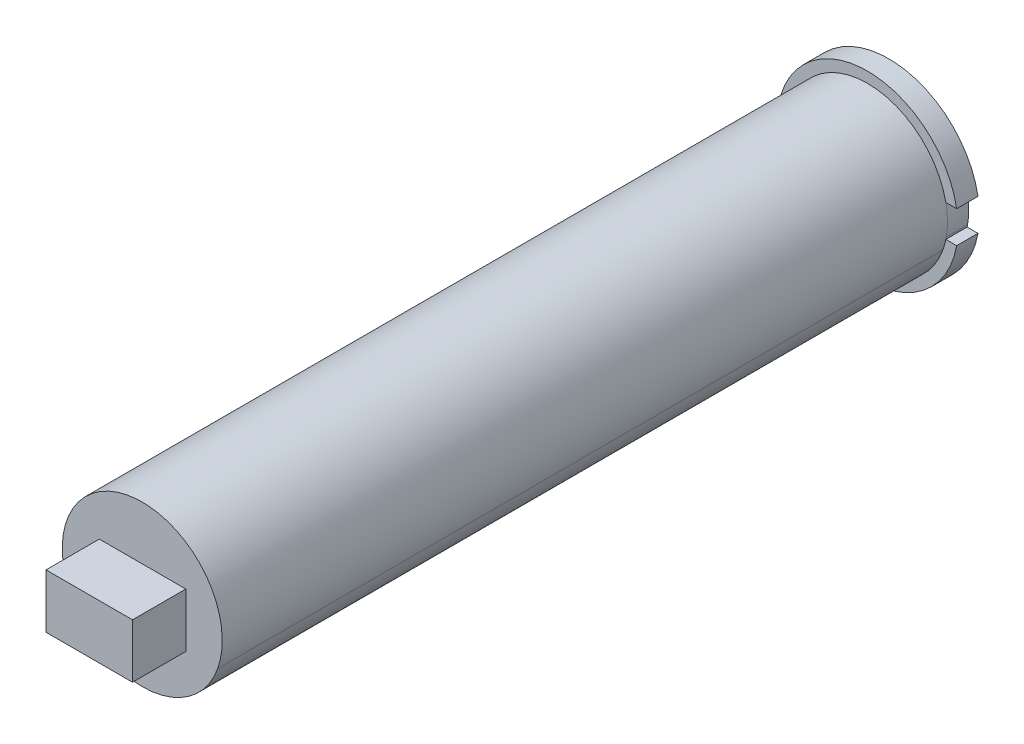
ISO-10303-21;
HEADER;
FILE_DESCRIPTION(('STEP AP214'),'2;1');
FILE_NAME('part.step','',(''),(''),'','','');
FILE_SCHEMA(('AUTOMOTIVE_DESIGN { 1 0 10303 214 1 1 1 1 }'));
ENDSEC;
DATA;
#1=APPLICATION_CONTEXT('core data for automotive mechanical design processes');
#2=APPLICATION_PROTOCOL_DEFINITION('international standard','automotive_design',2000,#1);
#3=PRODUCT_CONTEXT('',#1,'mechanical');
#4=PRODUCT('Part','Part','',(#3));
#5=PRODUCT_RELATED_PRODUCT_CATEGORY('part','',(#4));
#6=PRODUCT_DEFINITION_FORMATION('','',#4);
#7=PRODUCT_DEFINITION_CONTEXT('part definition',#1,'design');
#8=PRODUCT_DEFINITION('design','',#6,#7);
#9=PRODUCT_DEFINITION_SHAPE('','',#8);
#10=(LENGTH_UNIT() NAMED_UNIT(*) SI_UNIT(.MILLI.,.METRE.));
#11=(NAMED_UNIT(*) PLANE_ANGLE_UNIT() SI_UNIT($,.RADIAN.));
#12=(NAMED_UNIT(*) SI_UNIT($,.STERADIAN.) SOLID_ANGLE_UNIT());
#13=UNCERTAINTY_MEASURE_WITH_UNIT(LENGTH_MEASURE(1.E-05),#10,'distance_accuracy_value','');
#14=(GEOMETRIC_REPRESENTATION_CONTEXT(3) GLOBAL_UNCERTAINTY_ASSIGNED_CONTEXT((#13)) GLOBAL_UNIT_ASSIGNED_CONTEXT((#10,
#11,#12)) REPRESENTATION_CONTEXT('',''));
#15=CARTESIAN_POINT('',(0.,0.,0.));
#16=DIRECTION('',(0.,0.,1.));
#17=DIRECTION('',(1.,0.,0.));
#18=AXIS2_PLACEMENT_3D('',#15,#16,#17);
#19=CARTESIAN_POINT('',(0.,-2.19276085067222E-05,70.));
#20=DIRECTION('',(0.,0.,-1.));
#21=DIRECTION('',(-1.,0.,0.));
#22=AXIS2_PLACEMENT_3D('',#19,#20,#21);
#23=PLANE('',#22);
#24=CARTESIAN_POINT('',(0.,2.363829224028E-05,70.));
#25=DIRECTION('',(0.,0.,1.));
#26=DIRECTION('',(1.,0.,0.));
#27=AXIS2_PLACEMENT_3D('',#24,#25,#26);
#28=CIRCLE('',#27,7.49997237005401);
#29=CARTESIAN_POINT('',(7.07103819729768,-2.50000258335265,70.));
#30=VERTEX_POINT('',#29);
#31=CARTESIAN_POINT('',(-7.07103819729768,-2.50000258335265,70.));
#32=VERTEX_POINT('',#31);
#33=EDGE_CURVE('E204',#30,#32,#28,.T.);
#34=ORIENTED_EDGE('',*,*,#33,.T.);
#35=CARTESIAN_POINT('',(0.,-2.19276085067222E-05,70.));
#36=DIRECTION('',(0.,0.,1.));
#37=DIRECTION('',(1.,0.,0.));
#38=AXIS2_PLACEMENT_3D('',#35,#36,#37);
#39=CIRCLE('',#38,7.49997408073774);
#40=EDGE_CURVE('E12',#32,#30,#39,.T.);
#41=ORIENTED_EDGE('',*,*,#40,.T.);
#42=EDGE_LOOP('',(#34,#41));
#43=FACE_BOUND('',#42,.T.);
#44=DIRECTION('',(0.,-1.,0.));
#45=VECTOR('',#44,1.);
#46=CARTESIAN_POINT('',(-4.02605170519821,2.47573817180809,70.));
#47=LINE('',#46,#45);
#48=CARTESIAN_POINT('',(-4.02605170519821,2.47573817180809,70.));
#49=VERTEX_POINT('',#48);
#50=CARTESIAN_POINT('',(-4.02605170519821,-2.59368477236334,70.));
#51=VERTEX_POINT('',#50);
#52=EDGE_CURVE('E57',#49,#51,#47,.T.);
#53=ORIENTED_EDGE('',*,*,#52,.F.);
#54=DIRECTION('',(-1.,0.,0.));
#55=VECTOR('',#54,1.);
#56=CARTESIAN_POINT('',(-4.02605170519821,2.47573817180809,70.));
#57=LINE('',#56,#55);
#58=CARTESIAN_POINT('',(4.08502500547608,2.47573817180809,70.));
#59=VERTEX_POINT('',#58);
#60=EDGE_CURVE('E61',#59,#49,#57,.T.);
#61=ORIENTED_EDGE('',*,*,#60,.F.);
#62=DIRECTION('',(0.,1.,0.));
#63=VECTOR('',#62,1.);
#64=CARTESIAN_POINT('',(4.08502500547608,2.47573817180809,70.));
#65=LINE('',#64,#63);
#66=CARTESIAN_POINT('',(4.08502500547608,-2.59368477236334,70.));
#67=VERTEX_POINT('',#66);
#68=EDGE_CURVE('E569',#67,#59,#65,.T.);
#69=ORIENTED_EDGE('',*,*,#68,.F.);
#70=DIRECTION('',(1.,0.,0.));
#71=VECTOR('',#70,1.);
#72=CARTESIAN_POINT('',(-4.02605170519821,-2.59368477236334,70.));
#73=LINE('',#72,#71);
#74=EDGE_CURVE('E575',#51,#67,#73,.T.);
#75=ORIENTED_EDGE('',*,*,#74,.F.);
#76=EDGE_LOOP('',(#53,#61,#69,#75));
#77=FACE_BOUND('',#76,.T.);
#78=ADVANCED_FACE('F40',(#43,#77),#23,.F.);
#79=CARTESIAN_POINT('',(0.,0.,2.));
#80=DIRECTION('',(0.,0.,1.));
#81=DIRECTION('',(1.,0.,0.));
#82=AXIS2_PLACEMENT_3D('',#79,#80,#81);
#83=PLANE('',#82);
#84=DIRECTION('',(1.,0.,0.));
#85=VECTOR('',#84,1.);
#86=CARTESIAN_POINT('',(-8.36657714843747,1.4999960083463,2.));
#87=LINE('',#86,#85);
#88=CARTESIAN_POINT('',(-8.36657714843747,1.4999960083463,2.));
#89=VERTEX_POINT('',#88);
#90=CARTESIAN_POINT('',(-7.34844666855847,1.4999960083463,2.));
#91=VERTEX_POINT('',#90);
#92=EDGE_CURVE('E416',#89,#91,#87,.T.);
#93=ORIENTED_EDGE('',*,*,#92,.T.);
#94=CARTESIAN_POINT('',(0.,2.363829224028E-05,2.));
#95=DIRECTION('',(0.,0.,1.));
#96=DIRECTION('',(1.,0.,0.));
#97=AXIS2_PLACEMENT_3D('',#94,#95,#96);
#98=CIRCLE('',#97,7.49997237005401);
#99=CARTESIAN_POINT('',(7.34844679009372,1.49999541293832,2.));
#100=VERTEX_POINT('',#99);
#101=EDGE_CURVE('E210',#100,#91,#98,.T.);
#102=ORIENTED_EDGE('',*,*,#101,.F.);
#103=DIRECTION('',(1.,0.,0.));
#104=VECTOR('',#103,1.);
#105=CARTESIAN_POINT('',(8.36657714843747,1.4999960083463,2.));
#106=LINE('',#105,#104);
#107=CARTESIAN_POINT('',(8.36657714843747,1.4999960083463,2.));
#108=VERTEX_POINT('',#107);
#109=EDGE_CURVE('E399',#100,#108,#106,.T.);
#110=ORIENTED_EDGE('',*,*,#109,.T.);
#111=CARTESIAN_POINT('',(0.,2.363829224028E-05,2.));
#112=DIRECTION('',(0.,0.,1.));
#113=DIRECTION('',(1.,0.,0.));
#114=AXIS2_PLACEMENT_3D('',#111,#112,#113);
#115=CIRCLE('',#114,8.49997237005402);
#116=EDGE_CURVE('E402',#108,#89,#115,.T.);
#117=ORIENTED_EDGE('',*,*,#116,.T.);
#118=EDGE_LOOP('',(#93,#102,#110,#117));
#119=FACE_BOUND('',#118,.T.);
#120=ADVANCED_FACE('F363',(#119),#83,.T.);
#121=CARTESIAN_POINT('',(0.,2.363829224028E-05,2.));
#122=DIRECTION('',(0.,0.,1.));
#123=DIRECTION('',(1.,0.,0.));
#124=AXIS2_PLACEMENT_3D('',#121,#122,#123);
#125=CIRCLE('',#124,7.49997237005402);
#126=CARTESIAN_POINT('',(-7.07103841952553,-2.5000019548068,2.));
#127=VERTEX_POINT('',#126);
#128=EDGE_CURVE('E186',#91,#127,#125,.T.);
#129=ORIENTED_EDGE('',*,*,#128,.F.);
#130=CARTESIAN_POINT('',(-0.000946561122261436,-3.99165370201793E-06,2.));
#131=DIRECTION('',(0.,0.,1.));
#132=DIRECTION('',(1.,0.,0.));
#133=AXIS2_PLACEMENT_3D('',#130,#131,#132);
#134=CIRCLE('',#133,7.49905343887769);
#135=CARTESIAN_POINT('',(-7.3484497070313,-1.5000039916537,2.));
#136=VERTEX_POINT('',#135);
#137=EDGE_CURVE('E418',#91,#136,#134,.T.);
#138=ORIENTED_EDGE('',*,*,#137,.T.);
#139=DIRECTION('',(-1.,0.,0.));
#140=VECTOR('',#139,1.);
#141=CARTESIAN_POINT('',(-7.3484497070313,-1.5000039916537,2.));
#142=LINE('',#141,#140);
#143=CARTESIAN_POINT('',(-8.36657714843747,-1.5000039916537,2.));
#144=VERTEX_POINT('',#143);
#145=EDGE_CURVE('E49',#136,#144,#142,.T.);
#146=ORIENTED_EDGE('',*,*,#145,.T.);
#147=CARTESIAN_POINT('',(0.,-2.19276085067222E-05,2.));
#148=DIRECTION('',(0.,0.,1.));
#149=DIRECTION('',(1.,0.,0.));
#150=AXIS2_PLACEMENT_3D('',#147,#148,#149);
#151=CIRCLE('',#150,8.49997408073774);
#152=CARTESIAN_POINT('',(8.36657714843747,-1.5000039916537,2.));
#153=VERTEX_POINT('',#152);
#154=EDGE_CURVE('E264',#144,#153,#151,.T.);
#155=ORIENTED_EDGE('',*,*,#154,.T.);
#156=DIRECTION('',(-1.,0.,0.));
#157=VECTOR('',#156,1.);
#158=CARTESIAN_POINT('',(7.34844970703119,-1.5000039916537,2.));
#159=LINE('',#158,#157);
#160=CARTESIAN_POINT('',(7.34844970703119,-1.5000039916537,2.));
#161=VERTEX_POINT('',#160);
#162=EDGE_CURVE('E261',#153,#161,#159,.T.);
#163=ORIENTED_EDGE('',*,*,#162,.T.);
#164=DIRECTION('',(0.186875116396291,0.98238367803617,0.));
#165=VECTOR('',#164,1.);
#166=CARTESIAN_POINT('',(7.38604736328119,-1.30235689692715,2.));
#167=LINE('',#166,#165);
#168=CARTESIAN_POINT('',(7.34864666142599,-1.49896862222355,2.));
#169=VERTEX_POINT('',#168);
#170=EDGE_CURVE('E254',#161,#169,#167,.T.);
#171=ORIENTED_EDGE('',*,*,#170,.T.);
#172=CARTESIAN_POINT('',(7.07103841952553,-2.50000195480681,2.));
#173=VERTEX_POINT('',#172);
#174=EDGE_CURVE('E178',#173,#169,#125,.T.);
#175=ORIENTED_EDGE('',*,*,#174,.F.);
#176=CARTESIAN_POINT('',(0.,-2.19276085067222E-05,2.));
#177=DIRECTION('',(0.,0.,1.));
#178=DIRECTION('',(1.,0.,0.));
#179=AXIS2_PLACEMENT_3D('',#176,#177,#178);
#180=CIRCLE('',#179,7.49997408073774);
#181=EDGE_CURVE('E207',#127,#173,#180,.T.);
#182=ORIENTED_EDGE('',*,*,#181,.F.);
#183=EDGE_LOOP('',(#129,#138,#146,#155,#163,#171,#175,#182));
#184=FACE_BOUND('',#183,.T.);
#185=ADVANCED_FACE('F359',(#184),#83,.T.);
#186=CARTESIAN_POINT('',(0.,-2.19276085067222E-05,70.));
#187=DIRECTION('',(0.,0.,-1.));
#188=DIRECTION('',(-1.,0.,0.));
#189=AXIS2_PLACEMENT_3D('',#186,#187,#188);
#190=CYLINDRICAL_SURFACE('',#189,8.49997408073774);
#191=ORIENTED_EDGE('',*,*,#154,.F.);
#192=DIRECTION('',(0.,0.,-1.));
#193=VECTOR('',#192,1.);
#194=CARTESIAN_POINT('',(-8.36657714843747,-1.5000039916537,70.));
#195=LINE('',#194,#193);
#196=CARTESIAN_POINT('',(-8.36657714843747,-1.5000039916537,0.));
#197=VERTEX_POINT('',#196);
#198=EDGE_CURVE('E293',#144,#197,#195,.T.);
#199=ORIENTED_EDGE('',*,*,#198,.T.);
#200=CARTESIAN_POINT('',(0.,-2.19276085067222E-05,0.));
#201=DIRECTION('',(0.,0.,1.));
#202=DIRECTION('',(-1.,0.,0.));
#203=AXIS2_PLACEMENT_3D('',#200,#201,#202);
#204=CIRCLE('',#203,8.49997408073774);
#205=CARTESIAN_POINT('',(8.36657714843747,-1.5000039916537,0.));
#206=VERTEX_POINT('',#205);
#207=EDGE_CURVE('E266',#197,#206,#204,.T.);
#208=ORIENTED_EDGE('',*,*,#207,.T.);
#209=DIRECTION('',(0.,0.,-1.));
#210=VECTOR('',#209,1.);
#211=CARTESIAN_POINT('',(8.36657714843747,-1.5000039916537,70.));
#212=LINE('',#211,#210);
#213=EDGE_CURVE('E309',#153,#206,#212,.T.);
#214=ORIENTED_EDGE('',*,*,#213,.F.);
#215=EDGE_LOOP('',(#191,#199,#208,#214));
#216=FACE_BOUND('',#215,.T.);
#217=ADVANCED_FACE('F42',(#216),#190,.T.);
#218=CARTESIAN_POINT('',(7.34844970703119,-1.5000039916537,70.));
#219=DIRECTION('',(0.,-1.,0.));
#220=DIRECTION('',(0.,0.,-1.));
#221=AXIS2_PLACEMENT_3D('',#218,#219,#220);
#222=PLANE('',#221);
#223=ORIENTED_EDGE('',*,*,#162,.F.);
#224=ORIENTED_EDGE('',*,*,#213,.T.);
#225=DIRECTION('',(-1.,0.,0.));
#226=VECTOR('',#225,1.);
#227=CARTESIAN_POINT('',(7.34844970703119,-1.5000039916537,0.));
#228=LINE('',#227,#226);
#229=CARTESIAN_POINT('',(7.34844970703119,-1.5000039916537,0.));
#230=VERTEX_POINT('',#229);
#231=EDGE_CURVE('E269',#206,#230,#228,.T.);
#232=ORIENTED_EDGE('',*,*,#231,.T.);
#233=DIRECTION('',(0.,0.,-1.));
#234=VECTOR('',#233,1.);
#235=CARTESIAN_POINT('',(7.34844970703119,-1.5000039916537,70.));
#236=LINE('',#235,#234);
#237=EDGE_CURVE('E307',#161,#230,#236,.T.);
#238=ORIENTED_EDGE('',*,*,#237,.F.);
#239=EDGE_LOOP('',(#223,#224,#232,#238));
#240=FACE_BOUND('',#239,.T.);
#241=ADVANCED_FACE('F351',(#240),#222,.F.);
#242=CARTESIAN_POINT('',(7.38604736328119,-1.30235689692715,70.));
#243=DIRECTION('',(-0.98238367803617,0.186875116396291,0.));
#244=DIRECTION('',(-0.186875116396291,-0.98238367803617,0.));
#245=AXIS2_PLACEMENT_3D('',#242,#243,#244);
#246=PLANE('',#245);
#247=ORIENTED_EDGE('',*,*,#170,.F.);
#248=ORIENTED_EDGE('',*,*,#237,.T.);
#249=DIRECTION('',(0.186875116396291,0.98238367803617,0.));
#250=VECTOR('',#249,1.);
#251=CARTESIAN_POINT('',(7.38604736328119,-1.30235689692715,0.));
#252=LINE('',#251,#250);
#253=CARTESIAN_POINT('',(7.38604736328119,-1.30235689692715,0.));
#254=VERTEX_POINT('',#253);
#255=EDGE_CURVE('E272',#230,#254,#252,.T.);
#256=ORIENTED_EDGE('',*,*,#255,.T.);
#257=DIRECTION('',(0.,0.,-1.));
#258=VECTOR('',#257,1.);
#259=CARTESIAN_POINT('',(7.38604736328119,-1.30235689692715,70.));
#260=LINE('',#259,#258);
#261=CARTESIAN_POINT('',(7.38604736328119,-1.30235689692715,2.));
#262=VERTEX_POINT('',#261);
#263=EDGE_CURVE('E305',#262,#254,#260,.T.);
#264=ORIENTED_EDGE('',*,*,#263,.F.);
#265=CARTESIAN_POINT('',(7.38576242539026,-1.30385478674093,2.));
#266=VERTEX_POINT('',#265);
#267=EDGE_CURVE('E251',#266,#262,#167,.T.);
#268=ORIENTED_EDGE('',*,*,#267,.F.);
#269=CARTESIAN_POINT('',(0.,2.363829224028E-05,2.));
#270=DIRECTION('',(0.,0.,1.));
#271=DIRECTION('',(0.97982316451828,-0.199866371041711,0.));
#272=AXIS2_PLACEMENT_3D('',#269,#270,#271);
#273=CIRCLE('',#272,7.49997237005401);
#274=EDGE_CURVE('E201',#169,#266,#273,.T.);
#275=ORIENTED_EDGE('',*,*,#274,.F.);
#276=EDGE_LOOP('',(#247,#248,#256,#264,#268,#275));
#277=FACE_BOUND('',#276,.T.);
#278=ADVANCED_FACE('F341',(#277),#246,.F.);
#279=CARTESIAN_POINT('',(0.000876369651070519,-1.10833462685367E-05,70.));
#280=DIRECTION('',(0.,0.,-1.));
#281=DIRECTION('',(-1.,0.,0.));
#282=AXIS2_PLACEMENT_3D('',#279,#280,#281);
#283=CYLINDRICAL_SURFACE('',#282,7.49912363035223);
#284=CARTESIAN_POINT('',(0.000876369651070519,-1.10833462685367E-05,2.));
#285=DIRECTION('',(0.,0.,1.));
#286=DIRECTION('',(1.,0.,0.));
#287=AXIS2_PLACEMENT_3D('',#284,#285,#286);
#288=CIRCLE('',#287,7.49912363035223);
#289=EDGE_CURVE('E255',#262,#100,#288,.T.);
#290=ORIENTED_EDGE('',*,*,#289,.F.);
#291=ORIENTED_EDGE('',*,*,#263,.T.);
#292=CARTESIAN_POINT('',(0.000876369651070519,-1.10833462685367E-05,0.));
#293=DIRECTION('',(0.,0.,1.));
#294=DIRECTION('',(-1.,0.,0.));
#295=AXIS2_PLACEMENT_3D('',#292,#293,#294);
#296=CIRCLE('',#295,7.49912363035223);
#297=CARTESIAN_POINT('',(7.34844970703119,1.4999960083463,0.));
#298=VERTEX_POINT('',#297);
#299=EDGE_CURVE('E275',#254,#298,#296,.T.);
#300=ORIENTED_EDGE('',*,*,#299,.T.);
#301=DIRECTION('',(0.,0.,-1.));
#302=VECTOR('',#301,1.);
#303=CARTESIAN_POINT('',(7.34844970703119,1.4999960083463,70.));
#304=LINE('',#303,#302);
#305=EDGE_CURVE('E303',#100,#298,#304,.T.);
#306=ORIENTED_EDGE('',*,*,#305,.F.);
#307=EDGE_LOOP('',(#290,#291,#300,#306));
#308=FACE_BOUND('',#307,.T.);
#309=ADVANCED_FACE('F350',(#308),#283,.T.);
#310=CARTESIAN_POINT('',(8.36657714843747,1.4999960083463,70.));
#311=DIRECTION('',(0.,1.,0.));
#312=DIRECTION('',(0.,0.,1.));
#313=AXIS2_PLACEMENT_3D('',#310,#311,#312);
#314=PLANE('',#313);
#315=ORIENTED_EDGE('',*,*,#109,.F.);
#316=ORIENTED_EDGE('',*,*,#305,.T.);
#317=DIRECTION('',(1.,0.,0.));
#318=VECTOR('',#317,1.);
#319=CARTESIAN_POINT('',(8.36657714843747,1.4999960083463,0.));
#320=LINE('',#319,#318);
#321=CARTESIAN_POINT('',(8.36657714843747,1.4999960083463,0.));
#322=VERTEX_POINT('',#321);
#323=EDGE_CURVE('E278',#298,#322,#320,.T.);
#324=ORIENTED_EDGE('',*,*,#323,.T.);
#325=DIRECTION('',(0.,0.,-1.));
#326=VECTOR('',#325,1.);
#327=CARTESIAN_POINT('',(8.36657714843747,1.4999960083463,70.));
#328=LINE('',#327,#326);
#329=EDGE_CURVE('E301',#108,#322,#328,.T.);
#330=ORIENTED_EDGE('',*,*,#329,.F.);
#331=EDGE_LOOP('',(#315,#316,#324,#330));
#332=FACE_BOUND('',#331,.T.);
#333=ADVANCED_FACE('F389',(#332),#314,.F.);
#334=CARTESIAN_POINT('',(0.,2.363829224028E-05,70.));
#335=DIRECTION('',(0.,0.,-1.));
#336=DIRECTION('',(-1.,0.,0.));
#337=AXIS2_PLACEMENT_3D('',#334,#335,#336);
#338=CYLINDRICAL_SURFACE('',#337,8.49997237005402);
#339=ORIENTED_EDGE('',*,*,#116,.F.);
#340=ORIENTED_EDGE('',*,*,#329,.T.);
#341=CARTESIAN_POINT('',(0.,2.363829224028E-05,0.));
#342=DIRECTION('',(0.,0.,1.));
#343=DIRECTION('',(1.,0.,0.));
#344=AXIS2_PLACEMENT_3D('',#341,#342,#343);
#345=CIRCLE('',#344,8.49997237005402);
#346=CARTESIAN_POINT('',(-8.36657714843747,1.4999960083463,0.));
#347=VERTEX_POINT('',#346);
#348=EDGE_CURVE('E281',#322,#347,#345,.T.);
#349=ORIENTED_EDGE('',*,*,#348,.T.);
#350=DIRECTION('',(0.,0.,-1.));
#351=VECTOR('',#350,1.);
#352=CARTESIAN_POINT('',(-8.36657714843747,1.4999960083463,70.));
#353=LINE('',#352,#351);
#354=EDGE_CURVE('E299',#89,#347,#353,.T.);
#355=ORIENTED_EDGE('',*,*,#354,.F.);
#356=EDGE_LOOP('',(#339,#340,#349,#355));
#357=FACE_BOUND('',#356,.T.);
#358=ADVANCED_FACE('F387',(#357),#338,.T.);
#359=CARTESIAN_POINT('',(-8.36657714843747,1.4999960083463,70.));
#360=DIRECTION('',(0.,1.,0.));
#361=DIRECTION('',(0.,0.,1.));
#362=AXIS2_PLACEMENT_3D('',#359,#360,#361);
#363=PLANE('',#362);
#364=ORIENTED_EDGE('',*,*,#92,.F.);
#365=ORIENTED_EDGE('',*,*,#354,.T.);
#366=DIRECTION('',(1.,0.,0.));
#367=VECTOR('',#366,1.);
#368=CARTESIAN_POINT('',(-8.36657714843747,1.4999960083463,0.));
#369=LINE('',#368,#367);
#370=CARTESIAN_POINT('',(-7.3484497070313,1.4999960083463,0.));
#371=VERTEX_POINT('',#370);
#372=EDGE_CURVE('E284',#347,#371,#369,.T.);
#373=ORIENTED_EDGE('',*,*,#372,.T.);
#374=DIRECTION('',(0.,0.,-1.));
#375=VECTOR('',#374,1.);
#376=CARTESIAN_POINT('',(-7.3484497070313,1.4999960083463,70.));
#377=LINE('',#376,#375);
#378=EDGE_CURVE('E297',#91,#371,#377,.T.);
#379=ORIENTED_EDGE('',*,*,#378,.F.);
#380=EDGE_LOOP('',(#364,#365,#373,#379));
#381=FACE_BOUND('',#380,.T.);
#382=ADVANCED_FACE('F383',(#381),#363,.F.);
#383=CARTESIAN_POINT('',(-0.000946561122261436,-3.99165370201793E-06,70.));
#384=DIRECTION('',(0.,0.,-1.));
#385=DIRECTION('',(-1.,0.,0.));
#386=AXIS2_PLACEMENT_3D('',#383,#384,#385);
#387=CYLINDRICAL_SURFACE('',#386,7.49905343887769);
#388=ORIENTED_EDGE('',*,*,#137,.F.);
#389=ORIENTED_EDGE('',*,*,#378,.T.);
#390=CARTESIAN_POINT('',(-0.000946561122261436,-3.99165370201793E-06,0.));
#391=DIRECTION('',(0.,0.,1.));
#392=DIRECTION('',(1.,0.,0.));
#393=AXIS2_PLACEMENT_3D('',#390,#391,#392);
#394=CIRCLE('',#393,7.49905343887769);
#395=CARTESIAN_POINT('',(-7.3484497070313,-1.5000039916537,0.));
#396=VERTEX_POINT('',#395);
#397=EDGE_CURVE('E287',#371,#396,#394,.T.);
#398=ORIENTED_EDGE('',*,*,#397,.T.);
#399=DIRECTION('',(0.,0.,-1.));
#400=VECTOR('',#399,1.);
#401=CARTESIAN_POINT('',(-7.3484497070313,-1.5000039916537,70.));
#402=LINE('',#401,#400);
#403=EDGE_CURVE('E295',#136,#396,#402,.T.);
#404=ORIENTED_EDGE('',*,*,#403,.F.);
#405=EDGE_LOOP('',(#388,#389,#398,#404));
#406=FACE_BOUND('',#405,.T.);
#407=ADVANCED_FACE('F379',(#406),#387,.T.);
#408=CARTESIAN_POINT('',(-7.3484497070313,-1.5000039916537,70.));
#409=DIRECTION('',(0.,-1.,0.));
#410=DIRECTION('',(0.,0.,-1.));
#411=AXIS2_PLACEMENT_3D('',#408,#409,#410);
#412=PLANE('',#411);
#413=ORIENTED_EDGE('',*,*,#145,.F.);
#414=ORIENTED_EDGE('',*,*,#403,.T.);
#415=DIRECTION('',(-1.,0.,0.));
#416=VECTOR('',#415,1.);
#417=CARTESIAN_POINT('',(-7.3484497070313,-1.5000039916537,0.));
#418=LINE('',#417,#416);
#419=EDGE_CURVE('E290',#396,#197,#418,.T.);
#420=ORIENTED_EDGE('',*,*,#419,.T.);
#421=ORIENTED_EDGE('',*,*,#198,.F.);
#422=EDGE_LOOP('',(#413,#414,#420,#421));
#423=FACE_BOUND('',#422,.T.);
#424=ADVANCED_FACE('F375',(#423),#412,.F.);
#425=CARTESIAN_POINT('',(0.,-2.19276085067222E-05,0.));
#426=DIRECTION('',(0.,0.,-1.));
#427=DIRECTION('',(-1.,0.,0.));
#428=AXIS2_PLACEMENT_3D('',#425,#426,#427);
#429=PLANE('',#428);
#430=ORIENTED_EDGE('',*,*,#207,.F.);
#431=ORIENTED_EDGE('',*,*,#419,.F.);
#432=ORIENTED_EDGE('',*,*,#397,.F.);
#433=ORIENTED_EDGE('',*,*,#372,.F.);
#434=ORIENTED_EDGE('',*,*,#348,.F.);
#435=ORIENTED_EDGE('',*,*,#323,.F.);
#436=ORIENTED_EDGE('',*,*,#299,.F.);
#437=ORIENTED_EDGE('',*,*,#255,.F.);
#438=ORIENTED_EDGE('',*,*,#231,.F.);
#439=EDGE_LOOP('',(#430,#431,#432,#433,#434,#435,#436,#437,#438));
#440=FACE_BOUND('',#439,.T.);
#441=ADVANCED_FACE('F372',(#440),#429,.T.);
#442=EDGE_CURVE('E175',#266,#100,#125,.T.);
#443=ORIENTED_EDGE('',*,*,#442,.F.);
#444=ORIENTED_EDGE('',*,*,#267,.T.);
#445=ORIENTED_EDGE('',*,*,#289,.T.);
#446=EDGE_LOOP('',(#443,#444,#445));
#447=FACE_BOUND('',#446,.T.);
#448=ADVANCED_FACE('F370',(#447),#83,.T.);
#449=CARTESIAN_POINT('',(0.,-2.19276085067222E-05,2.));
#450=DIRECTION('',(0.,0.,1.));
#451=DIRECTION('',(1.,0.,0.));
#452=AXIS2_PLACEMENT_3D('',#449,#450,#451);
#453=CYLINDRICAL_SURFACE('',#452,7.49997408073774);
#454=ORIENTED_EDGE('',*,*,#40,.F.);
#455=CARTESIAN_POINT('',(-7.07102873711319,-2.5000039916537,2.));
#456=DIRECTION('',(0.,0.,1.));
#457=VECTOR('',#456,1.);
#458=LINE('',#455,#457);
#459=EDGE_CURVE('E198',#127,#32,#458,.T.);
#460=ORIENTED_EDGE('',*,*,#459,.F.);
#461=ORIENTED_EDGE('',*,*,#181,.T.);
#462=CARTESIAN_POINT('',(7.07102873711319,-2.5000039916537,70.));
#463=DIRECTION('',(0.,0.,-1.));
#464=VECTOR('',#463,1.);
#465=LINE('',#462,#464);
#466=EDGE_CURVE('E194',#30,#173,#465,.T.);
#467=ORIENTED_EDGE('',*,*,#466,.F.);
#468=EDGE_LOOP('',(#454,#460,#461,#467));
#469=FACE_BOUND('',#468,.T.);
#470=ADVANCED_FACE('F227',(#469),#453,.T.);
#471=CARTESIAN_POINT('',(0.,2.363829224028E-05,2.));
#472=DIRECTION('',(0.,0.,1.));
#473=DIRECTION('',(1.,0.,0.));
#474=AXIS2_PLACEMENT_3D('',#471,#472,#473);
#475=CYLINDRICAL_SURFACE('',#474,7.49997237005401);
#476=ORIENTED_EDGE('',*,*,#33,.F.);
#477=ORIENTED_EDGE('',*,*,#466,.T.);
#478=ORIENTED_EDGE('',*,*,#174,.T.);
#479=ORIENTED_EDGE('',*,*,#274,.T.);
#480=ORIENTED_EDGE('',*,*,#442,.T.);
#481=ORIENTED_EDGE('',*,*,#101,.T.);
#482=ORIENTED_EDGE('',*,*,#128,.T.);
#483=ORIENTED_EDGE('',*,*,#459,.T.);
#484=EDGE_LOOP('',(#476,#477,#478,#479,#480,#481,#482,#483));
#485=FACE_BOUND('',#484,.T.);
#486=ADVANCED_FACE('F217',(#485),#475,.T.);
#487=CARTESIAN_POINT('',(-4.02605170519821,2.47573817180809,75.));
#488=DIRECTION('',(1.,0.,0.));
#489=DIRECTION('',(0.,0.,-1.));
#490=AXIS2_PLACEMENT_3D('',#487,#488,#489);
#491=PLANE('',#490);
#492=ORIENTED_EDGE('',*,*,#52,.T.);
#493=DIRECTION('',(0.,0.,-1.));
#494=VECTOR('',#493,1.);
#495=CARTESIAN_POINT('',(-4.02605170519821,-2.59368477236334,75.));
#496=LINE('',#495,#494);
#497=CARTESIAN_POINT('',(-4.02605170519821,-2.59368477236334,75.));
#498=VERTEX_POINT('',#497);
#499=EDGE_CURVE('E158',#498,#51,#496,.T.);
#500=ORIENTED_EDGE('',*,*,#499,.F.);
#501=DIRECTION('',(0.,-1.,0.));
#502=VECTOR('',#501,1.);
#503=CARTESIAN_POINT('',(-4.02605170519821,2.47573817180809,75.));
#504=LINE('',#503,#502);
#505=CARTESIAN_POINT('',(-4.02605170519821,2.47573817180809,75.));
#506=VERTEX_POINT('',#505);
#507=EDGE_CURVE('E164',#506,#498,#504,.T.);
#508=ORIENTED_EDGE('',*,*,#507,.F.);
#509=DIRECTION('',(0.,0.,-1.));
#510=VECTOR('',#509,1.);
#511=CARTESIAN_POINT('',(-4.02605170519821,2.47573817180809,75.));
#512=LINE('',#511,#510);
#513=EDGE_CURVE('E567',#506,#49,#512,.T.);
#514=ORIENTED_EDGE('',*,*,#513,.T.);
#515=EDGE_LOOP('',(#492,#500,#508,#514));
#516=FACE_BOUND('',#515,.T.);
#517=ADVANCED_FACE('F174',(#516),#491,.F.);
#518=CARTESIAN_POINT('',(-4.02605170519821,-2.59368477236334,75.));
#519=DIRECTION('',(0.,1.,0.));
#520=DIRECTION('',(0.,0.,1.));
#521=AXIS2_PLACEMENT_3D('',#518,#519,#520);
#522=PLANE('',#521);
#523=ORIENTED_EDGE('',*,*,#74,.T.);
#524=DIRECTION('',(0.,0.,-1.));
#525=VECTOR('',#524,1.);
#526=CARTESIAN_POINT('',(4.08502500547608,-2.59368477236334,75.));
#527=LINE('',#526,#525);
#528=CARTESIAN_POINT('',(4.08502500547608,-2.59368477236334,75.));
#529=VERTEX_POINT('',#528);
#530=EDGE_CURVE('E160',#529,#67,#527,.T.);
#531=ORIENTED_EDGE('',*,*,#530,.F.);
#532=DIRECTION('',(1.,0.,0.));
#533=VECTOR('',#532,1.);
#534=CARTESIAN_POINT('',(-4.02605170519821,-2.59368477236334,75.));
#535=LINE('',#534,#533);
#536=EDGE_CURVE('E153',#498,#529,#535,.T.);
#537=ORIENTED_EDGE('',*,*,#536,.F.);
#538=ORIENTED_EDGE('',*,*,#499,.T.);
#539=EDGE_LOOP('',(#523,#531,#537,#538));
#540=FACE_BOUND('',#539,.T.);
#541=ADVANCED_FACE('F156',(#540),#522,.F.);
#542=CARTESIAN_POINT('',(4.08502500547608,2.47573817180809,75.));
#543=DIRECTION('',(-1.,0.,0.));
#544=DIRECTION('',(0.,0.,1.));
#545=AXIS2_PLACEMENT_3D('',#542,#543,#544);
#546=PLANE('',#545);
#547=ORIENTED_EDGE('',*,*,#68,.T.);
#548=DIRECTION('',(0.,0.,-1.));
#549=VECTOR('',#548,1.);
#550=CARTESIAN_POINT('',(4.08502500547608,2.47573817180809,75.));
#551=LINE('',#550,#549);
#552=CARTESIAN_POINT('',(4.08502500547608,2.47573817180809,75.));
#553=VERTEX_POINT('',#552);
#554=EDGE_CURVE('E180',#553,#59,#551,.T.);
#555=ORIENTED_EDGE('',*,*,#554,.F.);
#556=DIRECTION('',(0.,1.,0.));
#557=VECTOR('',#556,1.);
#558=CARTESIAN_POINT('',(4.08502500547608,2.47573817180809,75.));
#559=LINE('',#558,#557);
#560=EDGE_CURVE('E163',#529,#553,#559,.T.);
#561=ORIENTED_EDGE('',*,*,#560,.F.);
#562=ORIENTED_EDGE('',*,*,#530,.T.);
#563=EDGE_LOOP('',(#547,#555,#561,#562));
#564=FACE_BOUND('',#563,.T.);
#565=ADVANCED_FACE('F535',(#564),#546,.F.);
#566=CARTESIAN_POINT('',(-4.02605170519821,2.47573817180809,75.));
#567=DIRECTION('',(0.,-1.,0.));
#568=DIRECTION('',(0.,0.,-1.));
#569=AXIS2_PLACEMENT_3D('',#566,#567,#568);
#570=PLANE('',#569);
#571=ORIENTED_EDGE('',*,*,#60,.T.);
#572=ORIENTED_EDGE('',*,*,#513,.F.);
#573=DIRECTION('',(-1.,0.,0.));
#574=VECTOR('',#573,1.);
#575=CARTESIAN_POINT('',(-4.02605170519821,2.47573817180809,75.));
#576=LINE('',#575,#574);
#577=EDGE_CURVE('E169',#553,#506,#576,.T.);
#578=ORIENTED_EDGE('',*,*,#577,.F.);
#579=ORIENTED_EDGE('',*,*,#554,.T.);
#580=EDGE_LOOP('',(#571,#572,#578,#579));
#581=FACE_BOUND('',#580,.T.);
#582=ADVANCED_FACE('F542',(#581),#570,.F.);
#583=CARTESIAN_POINT('',(0.,0.,75.));
#584=DIRECTION('',(0.,0.,1.));
#585=DIRECTION('',(1.,0.,0.));
#586=AXIS2_PLACEMENT_3D('',#583,#584,#585);
#587=PLANE('',#586);
#588=ORIENTED_EDGE('',*,*,#507,.T.);
#589=ORIENTED_EDGE('',*,*,#536,.T.);
#590=ORIENTED_EDGE('',*,*,#560,.T.);
#591=ORIENTED_EDGE('',*,*,#577,.T.);
#592=EDGE_LOOP('',(#588,#589,#590,#591));
#593=FACE_BOUND('',#592,.T.);
#594=ADVANCED_FACE('F167',(#593),#587,.T.);
#595=CLOSED_SHELL('',(#78,#120,#185,#217,#241,#278,#309,#333,#358,#382,#407,#424,#441,#448,#470,
#486,#517,#541,#565,#582,#594));
#596=MANIFOLD_SOLID_BREP('B2',#595);
#597=ADVANCED_BREP_SHAPE_REPRESENTATION('',(#18,#596),#14);
#598=SHAPE_DEFINITION_REPRESENTATION(#9,#597);
ENDSEC;
END-ISO-10303-21;
